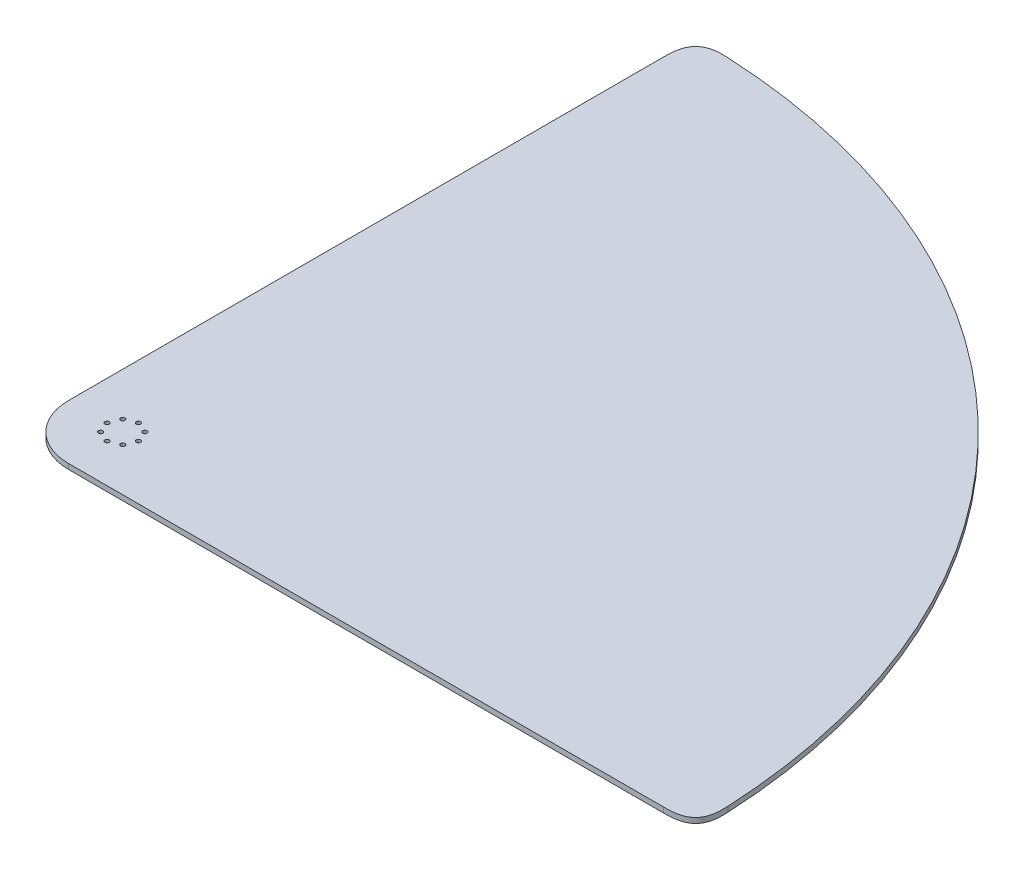
ISO-10303-21;
HEADER;
FILE_DESCRIPTION(('STEP AP214'),'2;1');
FILE_NAME('part.step','',(''),(''),'','','');
FILE_SCHEMA(('AUTOMOTIVE_DESIGN { 1 0 10303 214 1 1 1 1 }'));
ENDSEC;
DATA;
#1=APPLICATION_CONTEXT('core data for automotive mechanical design processes');
#2=APPLICATION_PROTOCOL_DEFINITION('international standard','automotive_design',2000,#1);
#3=PRODUCT_CONTEXT('',#1,'mechanical');
#4=PRODUCT('Part','Part','',(#3));
#5=PRODUCT_RELATED_PRODUCT_CATEGORY('part','',(#4));
#6=PRODUCT_DEFINITION_FORMATION('','',#4);
#7=PRODUCT_DEFINITION_CONTEXT('part definition',#1,'design');
#8=PRODUCT_DEFINITION('design','',#6,#7);
#9=PRODUCT_DEFINITION_SHAPE('','',#8);
#10=(LENGTH_UNIT() NAMED_UNIT(*) SI_UNIT(.MILLI.,.METRE.));
#11=(NAMED_UNIT(*) PLANE_ANGLE_UNIT() SI_UNIT($,.RADIAN.));
#12=(NAMED_UNIT(*) SI_UNIT($,.STERADIAN.) SOLID_ANGLE_UNIT());
#13=UNCERTAINTY_MEASURE_WITH_UNIT(LENGTH_MEASURE(1.E-05),#10,'distance_accuracy_value','');
#14=(GEOMETRIC_REPRESENTATION_CONTEXT(3) GLOBAL_UNCERTAINTY_ASSIGNED_CONTEXT((#13)) GLOBAL_UNIT_ASSIGNED_CONTEXT((#10,
#11,#12)) REPRESENTATION_CONTEXT('',''));
#15=CARTESIAN_POINT('',(0.,0.,0.));
#16=DIRECTION('',(0.,0.,1.));
#17=DIRECTION('',(1.,0.,0.));
#18=AXIS2_PLACEMENT_3D('',#15,#16,#17);
#19=CARTESIAN_POINT('',(0.,-5.,0.));
#20=DIRECTION('',(0.,1.,0.));
#21=DIRECTION('',(0.,0.,1.));
#22=AXIS2_PLACEMENT_3D('',#19,#20,#21);
#23=CYLINDRICAL_SURFACE('',#22,52.);
#24=CARTESIAN_POINT('',(0.,0.,0.));
#25=DIRECTION('',(0.,1.,0.));
#26=DIRECTION('',(0.,0.,1.));
#27=AXIS2_PLACEMENT_3D('',#24,#25,#26);
#28=CIRCLE('',#27,52.);
#29=CARTESIAN_POINT('',(-52.,0.,0.));
#30=VERTEX_POINT('',#29);
#31=CARTESIAN_POINT('',(0.,0.,52.));
#32=VERTEX_POINT('',#31);
#33=EDGE_CURVE('E285',#30,#32,#28,.T.);
#34=ORIENTED_EDGE('',*,*,#33,.F.);
#35=DIRECTION('',(0.,1.,0.));
#36=VECTOR('',#35,1.);
#37=CARTESIAN_POINT('',(-52.,-5.,0.));
#38=LINE('',#37,#36);
#39=CARTESIAN_POINT('',(-52.,-5.,0.));
#40=VERTEX_POINT('',#39);
#41=EDGE_CURVE('E121',#40,#30,#38,.T.);
#42=ORIENTED_EDGE('',*,*,#41,.F.);
#43=CARTESIAN_POINT('',(0.,-5.,0.));
#44=DIRECTION('',(0.,1.,0.));
#45=DIRECTION('',(0.,0.,1.));
#46=AXIS2_PLACEMENT_3D('',#43,#44,#45);
#47=CIRCLE('',#46,52.);
#48=CARTESIAN_POINT('',(0.,-5.,52.));
#49=VERTEX_POINT('',#48);
#50=EDGE_CURVE('E126',#40,#49,#47,.T.);
#51=ORIENTED_EDGE('',*,*,#50,.T.);
#52=DIRECTION('',(0.,1.,0.));
#53=VECTOR('',#52,1.);
#54=CARTESIAN_POINT('',(0.,-5.,52.));
#55=LINE('',#54,#53);
#56=EDGE_CURVE('E111',#49,#32,#55,.T.);
#57=ORIENTED_EDGE('',*,*,#56,.T.);
#58=EDGE_LOOP('',(#34,#42,#51,#57));
#59=FACE_BOUND('',#58,.T.);
#60=ADVANCED_FACE('F48',(#59),#23,.T.);
#61=CARTESIAN_POINT('',(-52.,-5.,0.));
#62=DIRECTION('',(-1.,0.,0.));
#63=DIRECTION('',(0.,0.,1.));
#64=AXIS2_PLACEMENT_3D('',#61,#62,#63);
#65=PLANE('',#64);
#66=DIRECTION('',(0.,0.,1.));
#67=VECTOR('',#66,1.);
#68=CARTESIAN_POINT('',(-52.,0.,0.));
#69=LINE('',#68,#67);
#70=CARTESIAN_POINT('',(-52.,0.,-569.276106091325));
#71=VERTEX_POINT('',#70);
#72=EDGE_CURVE('E131',#71,#30,#69,.T.);
#73=ORIENTED_EDGE('',*,*,#72,.F.);
#74=CARTESIAN_POINT('',(-52.,-5.25,-569.276106091325));
#75=CARTESIAN_POINT('',(-52.,-3.41666666666647,-569.276106091325));
#76=CARTESIAN_POINT('',(-52.,-1.58333333333333,-569.276106091325));
#77=CARTESIAN_POINT('',(-52.,0.25,-569.276106091325));
#78=B_SPLINE_CURVE_WITH_KNOTS('',3,(#74,#75,#76,#77),.UNSPECIFIED.,.F.,.F.,(4,4),(-0.00025,
0.00525),.UNSPECIFIED.);
#79=CARTESIAN_POINT('',(-52.,-5.,-569.276106091325));
#80=VERTEX_POINT('',#79);
#81=EDGE_CURVE('E78',#71,#80,#78,.F.);
#82=ORIENTED_EDGE('',*,*,#81,.T.);
#83=DIRECTION('',(0.,0.,1.));
#84=VECTOR('',#83,1.);
#85=CARTESIAN_POINT('',(-52.,-5.,0.));
#86=LINE('',#85,#84);
#87=EDGE_CURVE('E122',#80,#40,#86,.T.);
#88=ORIENTED_EDGE('',*,*,#87,.T.);
#89=ORIENTED_EDGE('',*,*,#41,.T.);
#90=EDGE_LOOP('',(#73,#82,#88,#89));
#91=FACE_BOUND('',#90,.T.);
#92=ADVANCED_FACE('F194',(#91),#65,.T.);
#93=CARTESIAN_POINT('',(-52.,-5.,52.));
#94=DIRECTION('',(0.,1.,0.));
#95=DIRECTION('',(0.,0.,1.));
#96=AXIS2_PLACEMENT_3D('',#93,#94,#95);
#97=CYLINDRICAL_SURFACE('',#96,652.);
#98=CARTESIAN_POINT('',(-52.,-5.,52.));
#99=DIRECTION('',(0.,1.,0.));
#100=DIRECTION('',(0.,0.,-1.));
#101=AXIS2_PLACEMENT_3D('',#98,#99,#100);
#102=CIRCLE('',#101,652.);
#103=CARTESIAN_POINT('',(599.241191594122,-5.,20.5530546623794));
#104=VERTEX_POINT('',#103);
#105=CARTESIAN_POINT('',(-20.5530546623794,-5.,-599.241191594122));
#106=VERTEX_POINT('',#105);
#107=EDGE_CURVE('E127',#104,#106,#102,.T.);
#108=ORIENTED_EDGE('',*,*,#107,.T.);
#109=CARTESIAN_POINT('',(-20.5530546623794,0.25,-599.241191594122));
#110=CARTESIAN_POINT('',(-20.5530546623794,-1.58333333333333,-599.241191594122));
#111=CARTESIAN_POINT('',(-20.5530546623794,-3.41666666666647,-599.241191594122));
#112=CARTESIAN_POINT('',(-20.5530546623794,-5.25,-599.241191594122));
#113=B_SPLINE_CURVE_WITH_KNOTS('',3,(#109,#110,#111,#112),.UNSPECIFIED.,.F.,.F.,(4,4),(-0.00025,
0.00525),.UNSPECIFIED.);
#114=CARTESIAN_POINT('',(-20.5530546623794,0.,-599.241191594122));
#115=VERTEX_POINT('',#114);
#116=EDGE_CURVE('E272',#106,#115,#113,.F.);
#117=ORIENTED_EDGE('',*,*,#116,.T.);
#118=CARTESIAN_POINT('',(-52.,0.,52.));
#119=DIRECTION('',(0.,1.,0.));
#120=DIRECTION('',(0.,0.,-1.));
#121=AXIS2_PLACEMENT_3D('',#118,#119,#120);
#122=CIRCLE('',#121,652.);
#123=CARTESIAN_POINT('',(599.241191594122,0.,20.5530546623794));
#124=VERTEX_POINT('',#123);
#125=EDGE_CURVE('E133',#124,#115,#122,.T.);
#126=ORIENTED_EDGE('',*,*,#125,.F.);
#127=CARTESIAN_POINT('',(599.241191594122,-5.25,20.5530546623794));
#128=CARTESIAN_POINT('',(599.241191594122,-3.41666666666647,20.5530546623794));
#129=CARTESIAN_POINT('',(599.241191594122,-1.58333333333333,20.5530546623794));
#130=CARTESIAN_POINT('',(599.241191594122,0.25,20.5530546623794));
#131=B_SPLINE_CURVE_WITH_KNOTS('',3,(#127,#128,#129,#130),.UNSPECIFIED.,.F.,.F.,(4,4),(-0.00025,
0.00525),.UNSPECIFIED.);
#132=EDGE_CURVE('E267',#124,#104,#131,.F.);
#133=ORIENTED_EDGE('',*,*,#132,.T.);
#134=EDGE_LOOP('',(#108,#117,#126,#133));
#135=FACE_BOUND('',#134,.T.);
#136=ADVANCED_FACE('F191',(#135),#97,.T.);
#137=CARTESIAN_POINT('',(600.,-5.,51.9999999999999));
#138=DIRECTION('',(0.,0.,1.));
#139=DIRECTION('',(1.,0.,0.));
#140=AXIS2_PLACEMENT_3D('',#137,#138,#139);
#141=PLANE('',#140);
#142=DIRECTION('',(1.,0.,0.));
#143=VECTOR('',#142,1.);
#144=CARTESIAN_POINT('',(600.,-5.,51.9999999999999));
#145=LINE('',#144,#143);
#146=CARTESIAN_POINT('',(569.276106091325,-5.,51.9999999999999));
#147=VERTEX_POINT('',#146);
#148=EDGE_CURVE('E113',#49,#147,#145,.T.);
#149=ORIENTED_EDGE('',*,*,#148,.T.);
#150=CARTESIAN_POINT('',(569.276106091325,0.25,51.9999999999999));
#151=CARTESIAN_POINT('',(569.276106091325,-1.58333333333333,51.9999999999999));
#152=CARTESIAN_POINT('',(569.276106091325,-3.41666666666647,51.9999999999999));
#153=CARTESIAN_POINT('',(569.276106091325,-5.25,51.9999999999999));
#154=B_SPLINE_CURVE_WITH_KNOTS('',3,(#150,#151,#152,#153),.UNSPECIFIED.,.F.,.F.,(4,4),(-0.00025,
0.00525),.UNSPECIFIED.);
#155=CARTESIAN_POINT('',(569.276106091325,0.,51.9999999999999));
#156=VERTEX_POINT('',#155);
#157=EDGE_CURVE('E11',#147,#156,#154,.F.);
#158=ORIENTED_EDGE('',*,*,#157,.T.);
#159=DIRECTION('',(1.,0.,0.));
#160=VECTOR('',#159,1.);
#161=CARTESIAN_POINT('',(600.,0.,51.9999999999999));
#162=LINE('',#161,#160);
#163=EDGE_CURVE('E116',#32,#156,#162,.T.);
#164=ORIENTED_EDGE('',*,*,#163,.F.);
#165=ORIENTED_EDGE('',*,*,#56,.F.);
#166=EDGE_LOOP('',(#149,#158,#164,#165));
#167=FACE_BOUND('',#166,.T.);
#168=ADVANCED_FACE('F112',(#167),#141,.T.);
#169=CARTESIAN_POINT('',(0.,-5.,0.));
#170=DIRECTION('',(0.,1.,0.));
#171=DIRECTION('',(0.,0.,1.));
#172=AXIS2_PLACEMENT_3D('',#169,#170,#171);
#173=PLANE('',#172);
#174=CARTESIAN_POINT('',(0.,-5.,-15.));
#175=DIRECTION('',(0.,1.,0.));
#176=DIRECTION('',(0.,0.,1.));
#177=AXIS2_PLACEMENT_3D('',#174,#175,#176);
#178=CIRCLE('',#177,2.1);
#179=CARTESIAN_POINT('',(0.,-5.,-12.9));
#180=VERTEX_POINT('',#179);
#181=EDGE_CURVE('E377',#180,#180,#178,.T.);
#182=ORIENTED_EDGE('',*,*,#181,.T.);
#183=EDGE_LOOP('',(#182));
#184=FACE_BOUND('',#183,.T.);
#185=CARTESIAN_POINT('',(10.6066017177982,-5.,-10.6066017177982));
#186=DIRECTION('',(0.,1.,0.));
#187=DIRECTION('',(0.,0.,1.));
#188=AXIS2_PLACEMENT_3D('',#185,#186,#187);
#189=CIRCLE('',#188,2.1);
#190=CARTESIAN_POINT('',(10.6066017177982,-5.,-8.50660171779821));
#191=VERTEX_POINT('',#190);
#192=EDGE_CURVE('E373',#191,#191,#189,.T.);
#193=ORIENTED_EDGE('',*,*,#192,.T.);
#194=EDGE_LOOP('',(#193));
#195=FACE_BOUND('',#194,.T.);
#196=CARTESIAN_POINT('',(15.,-5.,0.));
#197=DIRECTION('',(0.,1.,0.));
#198=DIRECTION('',(0.,0.,1.));
#199=AXIS2_PLACEMENT_3D('',#196,#197,#198);
#200=CIRCLE('',#199,2.1);
#201=CARTESIAN_POINT('',(15.,-5.,2.1));
#202=VERTEX_POINT('',#201);
#203=EDGE_CURVE('E369',#202,#202,#200,.T.);
#204=ORIENTED_EDGE('',*,*,#203,.T.);
#205=EDGE_LOOP('',(#204));
#206=FACE_BOUND('',#205,.T.);
#207=CARTESIAN_POINT('',(10.6066017177982,-5.,10.6066017177982));
#208=DIRECTION('',(0.,1.,0.));
#209=DIRECTION('',(0.,0.,1.));
#210=AXIS2_PLACEMENT_3D('',#207,#208,#209);
#211=CIRCLE('',#210,2.1);
#212=CARTESIAN_POINT('',(10.6066017177982,-5.,12.7066017177982));
#213=VERTEX_POINT('',#212);
#214=EDGE_CURVE('E365',#213,#213,#211,.T.);
#215=ORIENTED_EDGE('',*,*,#214,.T.);
#216=EDGE_LOOP('',(#215));
#217=FACE_BOUND('',#216,.T.);
#218=CARTESIAN_POINT('',(0.,-5.,15.));
#219=DIRECTION('',(0.,1.,0.));
#220=DIRECTION('',(0.,0.,1.));
#221=AXIS2_PLACEMENT_3D('',#218,#219,#220);
#222=CIRCLE('',#221,2.1);
#223=CARTESIAN_POINT('',(0.,-5.,17.1));
#224=VERTEX_POINT('',#223);
#225=EDGE_CURVE('E361',#224,#224,#222,.T.);
#226=ORIENTED_EDGE('',*,*,#225,.T.);
#227=EDGE_LOOP('',(#226));
#228=FACE_BOUND('',#227,.T.);
#229=CARTESIAN_POINT('',(-10.6066017177982,-5.,10.6066017177982));
#230=DIRECTION('',(0.,1.,0.));
#231=DIRECTION('',(0.,0.,1.));
#232=AXIS2_PLACEMENT_3D('',#229,#230,#231);
#233=CIRCLE('',#232,2.1);
#234=CARTESIAN_POINT('',(-10.6066017177982,-5.,12.7066017177982));
#235=VERTEX_POINT('',#234);
#236=EDGE_CURVE('E357',#235,#235,#233,.T.);
#237=ORIENTED_EDGE('',*,*,#236,.T.);
#238=EDGE_LOOP('',(#237));
#239=FACE_BOUND('',#238,.T.);
#240=CARTESIAN_POINT('',(-15.,-5.,0.));
#241=DIRECTION('',(0.,1.,0.));
#242=DIRECTION('',(0.,0.,1.));
#243=AXIS2_PLACEMENT_3D('',#240,#241,#242);
#244=CIRCLE('',#243,2.1);
#245=CARTESIAN_POINT('',(-15.,-5.,2.1));
#246=VERTEX_POINT('',#245);
#247=EDGE_CURVE('E351',#246,#246,#244,.T.);
#248=ORIENTED_EDGE('',*,*,#247,.T.);
#249=EDGE_LOOP('',(#248));
#250=FACE_BOUND('',#249,.T.);
#251=CARTESIAN_POINT('',(-10.6066017177982,-5.,-10.6066017177982));
#252=DIRECTION('',(0.,1.,0.));
#253=DIRECTION('',(0.,0.,1.));
#254=AXIS2_PLACEMENT_3D('',#251,#252,#253);
#255=CIRCLE('',#254,2.1);
#256=CARTESIAN_POINT('',(-10.6066017177982,-5.,-8.50660171779822));
#257=VERTEX_POINT('',#256);
#258=EDGE_CURVE('E137',#257,#257,#255,.T.);
#259=ORIENTED_EDGE('',*,*,#258,.T.);
#260=EDGE_LOOP('',(#259));
#261=FACE_BOUND('',#260,.T.);
#262=ORIENTED_EDGE('',*,*,#87,.F.);
#263=CARTESIAN_POINT('',(-20.5530546623794,-5.,-599.241191594122));
#264=CARTESIAN_POINT('',(-25.9071720040652,-5.,-599.499729655824));
#265=CARTESIAN_POINT('',(-31.2092317808589,-5.,-599.700602723466));
#266=CARTESIAN_POINT('',(-42.659594251295,-5.,-597.949848077784));
#267=CARTESIAN_POINT('',(-49.6612800793085,-5.,-591.385368921393));
#268=CARTESIAN_POINT('',(-52.,-5.,-579.782278767682));
#269=CARTESIAN_POINT('',(-52.,-5.,-574.529192429504));
#270=CARTESIAN_POINT('',(-52.,-5.,-569.276106091325));
#271=B_SPLINE_CURVE_WITH_KNOTS('',5,(#263,#264,#265,#266,#267,#268,#269,#270),.UNSPECIFIED.,.F.,
.F.,(6,2,6),(0.,0.5,1.),.UNSPECIFIED.);
#272=EDGE_CURVE('E62',#80,#106,#271,.F.);
#273=ORIENTED_EDGE('',*,*,#272,.T.);
#274=ORIENTED_EDGE('',*,*,#107,.F.);
#275=CARTESIAN_POINT('',(569.276106091326,-5.,52.));
#276=CARTESIAN_POINT('',(574.529192429504,-5.,52.));
#277=CARTESIAN_POINT('',(579.782278767682,-5.,52.));
#278=CARTESIAN_POINT('',(591.385368921393,-5.,49.6612800793084));
#279=CARTESIAN_POINT('',(597.949848077784,-5.,42.659594251295));
#280=CARTESIAN_POINT('',(599.700602723467,-5.,31.2092317808588));
#281=CARTESIAN_POINT('',(599.499729655824,-5.,25.9071720040651));
#282=CARTESIAN_POINT('',(599.241191594122,-5.,20.5530546623794));
#283=B_SPLINE_CURVE_WITH_KNOTS('',5,(#275,#276,#277,#278,#279,#280,#281,#282),.UNSPECIFIED.,.F.,
.F.,(6,2,6),(0.,0.5,1.),.UNSPECIFIED.);
#284=EDGE_CURVE('E69',#104,#147,#283,.F.);
#285=ORIENTED_EDGE('',*,*,#284,.T.);
#286=ORIENTED_EDGE('',*,*,#148,.F.);
#287=ORIENTED_EDGE('',*,*,#50,.F.);
#288=EDGE_LOOP('',(#262,#273,#274,#285,#286,#287));
#289=FACE_BOUND('',#288,.T.);
#290=ADVANCED_FACE('F125',(#184,#195,#206,#217,#228,#239,#250,#261,#289),#173,.F.);
#291=CARTESIAN_POINT('',(0.,0.,0.));
#292=DIRECTION('',(0.,1.,0.));
#293=DIRECTION('',(0.,0.,1.));
#294=AXIS2_PLACEMENT_3D('',#291,#292,#293);
#295=PLANE('',#294);
#296=CARTESIAN_POINT('',(0.,0.,-15.));
#297=DIRECTION('',(0.,1.,0.));
#298=DIRECTION('',(0.,0.,1.));
#299=AXIS2_PLACEMENT_3D('',#296,#297,#298);
#300=CIRCLE('',#299,2.1);
#301=CARTESIAN_POINT('',(0.,0.,-12.9));
#302=VERTEX_POINT('',#301);
#303=EDGE_CURVE('E322',#302,#302,#300,.T.);
#304=ORIENTED_EDGE('',*,*,#303,.F.);
#305=EDGE_LOOP('',(#304));
#306=FACE_BOUND('',#305,.T.);
#307=CARTESIAN_POINT('',(10.6066017177982,0.,-10.6066017177982));
#308=DIRECTION('',(0.,1.,0.));
#309=DIRECTION('',(0.,0.,1.));
#310=AXIS2_PLACEMENT_3D('',#307,#308,#309);
#311=CIRCLE('',#310,2.1);
#312=CARTESIAN_POINT('',(10.6066017177982,0.,-8.50660171779821));
#313=VERTEX_POINT('',#312);
#314=EDGE_CURVE('E326',#313,#313,#311,.T.);
#315=ORIENTED_EDGE('',*,*,#314,.F.);
#316=EDGE_LOOP('',(#315));
#317=FACE_BOUND('',#316,.T.);
#318=CARTESIAN_POINT('',(15.,0.,0.));
#319=DIRECTION('',(0.,1.,0.));
#320=DIRECTION('',(0.,0.,1.));
#321=AXIS2_PLACEMENT_3D('',#318,#319,#320);
#322=CIRCLE('',#321,2.1);
#323=CARTESIAN_POINT('',(15.,0.,2.1));
#324=VERTEX_POINT('',#323);
#325=EDGE_CURVE('E330',#324,#324,#322,.T.);
#326=ORIENTED_EDGE('',*,*,#325,.F.);
#327=EDGE_LOOP('',(#326));
#328=FACE_BOUND('',#327,.T.);
#329=CARTESIAN_POINT('',(10.6066017177982,0.,10.6066017177982));
#330=DIRECTION('',(0.,1.,0.));
#331=DIRECTION('',(0.,0.,1.));
#332=AXIS2_PLACEMENT_3D('',#329,#330,#331);
#333=CIRCLE('',#332,2.1);
#334=CARTESIAN_POINT('',(10.6066017177982,0.,12.7066017177982));
#335=VERTEX_POINT('',#334);
#336=EDGE_CURVE('E334',#335,#335,#333,.T.);
#337=ORIENTED_EDGE('',*,*,#336,.F.);
#338=EDGE_LOOP('',(#337));
#339=FACE_BOUND('',#338,.T.);
#340=CARTESIAN_POINT('',(0.,0.,15.));
#341=DIRECTION('',(0.,1.,0.));
#342=DIRECTION('',(0.,0.,1.));
#343=AXIS2_PLACEMENT_3D('',#340,#341,#342);
#344=CIRCLE('',#343,2.1);
#345=CARTESIAN_POINT('',(0.,0.,17.1));
#346=VERTEX_POINT('',#345);
#347=EDGE_CURVE('E338',#346,#346,#344,.T.);
#348=ORIENTED_EDGE('',*,*,#347,.F.);
#349=EDGE_LOOP('',(#348));
#350=FACE_BOUND('',#349,.T.);
#351=CARTESIAN_POINT('',(-10.6066017177982,0.,10.6066017177982));
#352=DIRECTION('',(0.,1.,0.));
#353=DIRECTION('',(0.,0.,1.));
#354=AXIS2_PLACEMENT_3D('',#351,#352,#353);
#355=CIRCLE('',#354,2.1);
#356=CARTESIAN_POINT('',(-10.6066017177982,0.,12.7066017177982));
#357=VERTEX_POINT('',#356);
#358=EDGE_CURVE('E342',#357,#357,#355,.T.);
#359=ORIENTED_EDGE('',*,*,#358,.F.);
#360=EDGE_LOOP('',(#359));
#361=FACE_BOUND('',#360,.T.);
#362=CARTESIAN_POINT('',(-15.,0.,0.));
#363=DIRECTION('',(0.,1.,0.));
#364=DIRECTION('',(0.,0.,1.));
#365=AXIS2_PLACEMENT_3D('',#362,#363,#364);
#366=CIRCLE('',#365,2.1);
#367=CARTESIAN_POINT('',(-15.,0.,2.1));
#368=VERTEX_POINT('',#367);
#369=EDGE_CURVE('E346',#368,#368,#366,.T.);
#370=ORIENTED_EDGE('',*,*,#369,.F.);
#371=EDGE_LOOP('',(#370));
#372=FACE_BOUND('',#371,.T.);
#373=CARTESIAN_POINT('',(-10.6066017177982,0.,-10.6066017177982));
#374=DIRECTION('',(0.,1.,0.));
#375=DIRECTION('',(0.,0.,1.));
#376=AXIS2_PLACEMENT_3D('',#373,#374,#375);
#377=CIRCLE('',#376,2.1);
#378=CARTESIAN_POINT('',(-10.6066017177982,0.,-8.50660171779821));
#379=VERTEX_POINT('',#378);
#380=EDGE_CURVE('E349',#379,#379,#377,.T.);
#381=ORIENTED_EDGE('',*,*,#380,.F.);
#382=EDGE_LOOP('',(#381));
#383=FACE_BOUND('',#382,.T.);
#384=ORIENTED_EDGE('',*,*,#125,.T.);
#385=CARTESIAN_POINT('',(-52.,0.,-569.276106091325));
#386=CARTESIAN_POINT('',(-52.,0.,-574.529192429504));
#387=CARTESIAN_POINT('',(-52.,0.,-579.782278767682));
#388=CARTESIAN_POINT('',(-49.6612800793085,0.,-591.385368921393));
#389=CARTESIAN_POINT('',(-42.659594251295,0.,-597.949848077784));
#390=CARTESIAN_POINT('',(-31.2092317808589,0.,-599.700602723466));
#391=CARTESIAN_POINT('',(-25.9071720040652,0.,-599.499729655824));
#392=CARTESIAN_POINT('',(-20.5530546623794,0.,-599.241191594122));
#393=B_SPLINE_CURVE_WITH_KNOTS('',5,(#385,#386,#387,#388,#389,#390,#391,#392),.UNSPECIFIED.,.F.,
.F.,(6,2,6),(0.,0.5,1.),.UNSPECIFIED.);
#394=EDGE_CURVE('E303',#115,#71,#393,.F.);
#395=ORIENTED_EDGE('',*,*,#394,.T.);
#396=ORIENTED_EDGE('',*,*,#72,.T.);
#397=ORIENTED_EDGE('',*,*,#33,.T.);
#398=ORIENTED_EDGE('',*,*,#163,.T.);
#399=CARTESIAN_POINT('',(599.241191594122,0.,20.5530546623794));
#400=CARTESIAN_POINT('',(599.499729655824,0.,25.9071720040651));
#401=CARTESIAN_POINT('',(599.700602723466,0.,31.2092317808588));
#402=CARTESIAN_POINT('',(597.949848077784,0.,42.659594251295));
#403=CARTESIAN_POINT('',(591.385368921393,0.,49.6612800793084));
#404=CARTESIAN_POINT('',(579.782278767682,0.,51.9999999999999));
#405=CARTESIAN_POINT('',(574.529192429504,0.,51.9999999999999));
#406=CARTESIAN_POINT('',(569.276106091325,0.,51.9999999999999));
#407=B_SPLINE_CURVE_WITH_KNOTS('',5,(#399,#400,#401,#402,#403,#404,#405,#406),.UNSPECIFIED.,.F.,
.F.,(6,2,6),(0.,0.5,1.),.UNSPECIFIED.);
#408=EDGE_CURVE('E241',#156,#124,#407,.F.);
#409=ORIENTED_EDGE('',*,*,#408,.T.);
#410=EDGE_LOOP('',(#384,#395,#396,#397,#398,#409));
#411=FACE_BOUND('',#410,.T.);
#412=ADVANCED_FACE('F162',(#306,#317,#328,#339,#350,#361,#372,#383,#411),#295,.T.);
#413=CARTESIAN_POINT('',(-20.5530546623794,-5.25,-599.241191594122));
#414=CARTESIAN_POINT('',(-20.5530546623794,-3.41666666666647,-599.241191594122));
#415=CARTESIAN_POINT('',(-20.5530546623794,-1.58333333333333,-599.241191594122));
#416=CARTESIAN_POINT('',(-20.5530546623794,0.25,-599.241191594122));
#417=CARTESIAN_POINT('',(-25.9071720040652,-5.25,-599.499729655824));
#418=CARTESIAN_POINT('',(-25.9071720040652,-3.41666666666647,-599.499729655824));
#419=CARTESIAN_POINT('',(-25.9071720040652,-1.58333333333333,-599.499729655824));
#420=CARTESIAN_POINT('',(-25.9071720040652,0.25,-599.499729655824));
#421=CARTESIAN_POINT('',(-31.2092317808589,-5.25,-599.700602723466));
#422=CARTESIAN_POINT('',(-31.2092317808589,-3.41666666666647,-599.700602723466));
#423=CARTESIAN_POINT('',(-31.2092317808589,-1.58333333333333,-599.700602723466));
#424=CARTESIAN_POINT('',(-31.2092317808589,0.25,-599.700602723466));
#425=CARTESIAN_POINT('',(-42.659594251295,-5.25,-597.949848077784));
#426=CARTESIAN_POINT('',(-42.659594251295,-3.41666666666647,-597.949848077784));
#427=CARTESIAN_POINT('',(-42.659594251295,-1.58333333333333,-597.949848077784));
#428=CARTESIAN_POINT('',(-42.659594251295,0.25,-597.949848077784));
#429=CARTESIAN_POINT('',(-49.6612800793085,-5.25,-591.385368921393));
#430=CARTESIAN_POINT('',(-49.6612800793085,-3.41666666666647,-591.385368921393));
#431=CARTESIAN_POINT('',(-49.6612800793085,-1.58333333333333,-591.385368921393));
#432=CARTESIAN_POINT('',(-49.6612800793085,0.25,-591.385368921393));
#433=CARTESIAN_POINT('',(-52.,-5.25,-579.782278767682));
#434=CARTESIAN_POINT('',(-52.,-3.41666666666647,-579.782278767682));
#435=CARTESIAN_POINT('',(-52.,-1.58333333333333,-579.782278767682));
#436=CARTESIAN_POINT('',(-52.,0.25,-579.782278767682));
#437=CARTESIAN_POINT('',(-52.,-5.25,-574.529192429504));
#438=CARTESIAN_POINT('',(-52.,-3.41666666666647,-574.529192429504));
#439=CARTESIAN_POINT('',(-52.,-1.58333333333333,-574.529192429504));
#440=CARTESIAN_POINT('',(-52.,0.25,-574.529192429504));
#441=CARTESIAN_POINT('',(-52.,-5.25,-569.276106091325));
#442=CARTESIAN_POINT('',(-52.,-3.41666666666647,-569.276106091325));
#443=CARTESIAN_POINT('',(-52.,-1.58333333333333,-569.276106091325));
#444=CARTESIAN_POINT('',(-52.,0.25,-569.276106091325));
#445=B_SPLINE_SURFACE_WITH_KNOTS('',5,3,((#413,#414,#415,#416),(#417,#418,#419,#420),(#421,#422,
#423,#424),(#425,#426,#427,#428),(#429,#430,#431,#432),(#433,#434,#435,#436),(#437,#438,#439,
#440),(#441,#442,#443,#444)),.UNSPECIFIED.,.F.,.F.,.F.,(6,2,6),(4,4),(0.,0.5,1.),(-0.00025,
0.00525),.UNSPECIFIED.);
#446=ORIENTED_EDGE('',*,*,#272,.F.);
#447=ORIENTED_EDGE('',*,*,#81,.F.);
#448=ORIENTED_EDGE('',*,*,#394,.F.);
#449=ORIENTED_EDGE('',*,*,#116,.F.);
#450=EDGE_LOOP('',(#446,#447,#448,#449));
#451=FACE_BOUND('',#450,.T.);
#452=ADVANCED_FACE('F196',(#451),#445,.T.);
#453=CARTESIAN_POINT('',(569.276106091325,-5.25,51.9999999999999));
#454=CARTESIAN_POINT('',(569.276106091325,-3.41666666666647,51.9999999999999));
#455=CARTESIAN_POINT('',(569.276106091325,-1.58333333333333,51.9999999999999));
#456=CARTESIAN_POINT('',(569.276106091325,0.25,51.9999999999999));
#457=CARTESIAN_POINT('',(574.529192429504,-5.25,51.9999999999999));
#458=CARTESIAN_POINT('',(574.529192429504,-3.41666666666647,51.9999999999999));
#459=CARTESIAN_POINT('',(574.529192429504,-1.58333333333333,51.9999999999999));
#460=CARTESIAN_POINT('',(574.529192429504,0.25,51.9999999999999));
#461=CARTESIAN_POINT('',(579.782278767682,-5.25,51.9999999999999));
#462=CARTESIAN_POINT('',(579.782278767682,-3.41666666666647,51.9999999999999));
#463=CARTESIAN_POINT('',(579.782278767682,-1.58333333333333,51.9999999999999));
#464=CARTESIAN_POINT('',(579.782278767682,0.25,51.9999999999999));
#465=CARTESIAN_POINT('',(591.385368921393,-5.25,49.6612800793084));
#466=CARTESIAN_POINT('',(591.385368921393,-3.41666666666647,49.6612800793084));
#467=CARTESIAN_POINT('',(591.385368921393,-1.58333333333333,49.6612800793084));
#468=CARTESIAN_POINT('',(591.385368921393,0.25,49.6612800793084));
#469=CARTESIAN_POINT('',(597.949848077784,-5.25,42.659594251295));
#470=CARTESIAN_POINT('',(597.949848077784,-3.41666666666647,42.659594251295));
#471=CARTESIAN_POINT('',(597.949848077784,-1.58333333333333,42.659594251295));
#472=CARTESIAN_POINT('',(597.949848077784,0.25,42.659594251295));
#473=CARTESIAN_POINT('',(599.700602723466,-5.25,31.2092317808588));
#474=CARTESIAN_POINT('',(599.700602723466,-3.41666666666647,31.2092317808588));
#475=CARTESIAN_POINT('',(599.700602723466,-1.58333333333333,31.2092317808588));
#476=CARTESIAN_POINT('',(599.700602723466,0.25,31.2092317808588));
#477=CARTESIAN_POINT('',(599.499729655824,-5.25,25.9071720040651));
#478=CARTESIAN_POINT('',(599.499729655824,-3.41666666666647,25.9071720040651));
#479=CARTESIAN_POINT('',(599.499729655824,-1.58333333333333,25.9071720040651));
#480=CARTESIAN_POINT('',(599.499729655824,0.25,25.9071720040651));
#481=CARTESIAN_POINT('',(599.241191594122,-5.25,20.5530546623794));
#482=CARTESIAN_POINT('',(599.241191594122,-3.41666666666647,20.5530546623794));
#483=CARTESIAN_POINT('',(599.241191594122,-1.58333333333333,20.5530546623794));
#484=CARTESIAN_POINT('',(599.241191594122,0.25,20.5530546623794));
#485=B_SPLINE_SURFACE_WITH_KNOTS('',5,3,((#453,#454,#455,#456),(#457,#458,#459,#460),(#461,#462,
#463,#464),(#465,#466,#467,#468),(#469,#470,#471,#472),(#473,#474,#475,#476),(#477,#478,#479,
#480),(#481,#482,#483,#484)),.UNSPECIFIED.,.F.,.F.,.F.,(6,2,6),(4,4),(0.,0.5,1.),(-0.00025,
0.00525),.UNSPECIFIED.);
#486=ORIENTED_EDGE('',*,*,#284,.F.);
#487=ORIENTED_EDGE('',*,*,#132,.F.);
#488=ORIENTED_EDGE('',*,*,#408,.F.);
#489=ORIENTED_EDGE('',*,*,#157,.F.);
#490=EDGE_LOOP('',(#486,#487,#488,#489));
#491=FACE_BOUND('',#490,.T.);
#492=ADVANCED_FACE('F51',(#491),#485,.T.);
#493=CARTESIAN_POINT('',(-10.6066017177982,0.,-10.6066017177982));
#494=DIRECTION('',(0.,1.,0.));
#495=DIRECTION('',(0.,0.,1.));
#496=AXIS2_PLACEMENT_3D('',#493,#494,#495);
#497=CYLINDRICAL_SURFACE('',#496,2.1);
#498=ORIENTED_EDGE('',*,*,#380,.T.);
#499=EDGE_LOOP('',(#498));
#500=FACE_BOUND('',#499,.T.);
#501=ORIENTED_EDGE('',*,*,#258,.F.);
#502=EDGE_LOOP('',(#501));
#503=FACE_BOUND('',#502,.T.);
#504=ADVANCED_FACE('F164',(#500,#503),#497,.F.);
#505=CARTESIAN_POINT('',(-15.,0.,0.));
#506=DIRECTION('',(0.,1.,0.));
#507=DIRECTION('',(0.,0.,1.));
#508=AXIS2_PLACEMENT_3D('',#505,#506,#507);
#509=CYLINDRICAL_SURFACE('',#508,2.1);
#510=ORIENTED_EDGE('',*,*,#369,.T.);
#511=EDGE_LOOP('',(#510));
#512=FACE_BOUND('',#511,.T.);
#513=ORIENTED_EDGE('',*,*,#247,.F.);
#514=EDGE_LOOP('',(#513));
#515=FACE_BOUND('',#514,.T.);
#516=ADVANCED_FACE('F403',(#512,#515),#509,.F.);
#517=CARTESIAN_POINT('',(-10.6066017177982,0.,10.6066017177982));
#518=DIRECTION('',(0.,1.,0.));
#519=DIRECTION('',(0.,0.,1.));
#520=AXIS2_PLACEMENT_3D('',#517,#518,#519);
#521=CYLINDRICAL_SURFACE('',#520,2.1);
#522=ORIENTED_EDGE('',*,*,#358,.T.);
#523=EDGE_LOOP('',(#522));
#524=FACE_BOUND('',#523,.T.);
#525=ORIENTED_EDGE('',*,*,#236,.F.);
#526=EDGE_LOOP('',(#525));
#527=FACE_BOUND('',#526,.T.);
#528=ADVANCED_FACE('F408',(#524,#527),#521,.F.);
#529=CARTESIAN_POINT('',(0.,0.,15.));
#530=DIRECTION('',(0.,1.,0.));
#531=DIRECTION('',(0.,0.,1.));
#532=AXIS2_PLACEMENT_3D('',#529,#530,#531);
#533=CYLINDRICAL_SURFACE('',#532,2.1);
#534=ORIENTED_EDGE('',*,*,#347,.T.);
#535=EDGE_LOOP('',(#534));
#536=FACE_BOUND('',#535,.T.);
#537=ORIENTED_EDGE('',*,*,#225,.F.);
#538=EDGE_LOOP('',(#537));
#539=FACE_BOUND('',#538,.T.);
#540=ADVANCED_FACE('F502',(#536,#539),#533,.F.);
#541=CARTESIAN_POINT('',(10.6066017177982,0.,10.6066017177982));
#542=DIRECTION('',(0.,1.,0.));
#543=DIRECTION('',(0.,0.,1.));
#544=AXIS2_PLACEMENT_3D('',#541,#542,#543);
#545=CYLINDRICAL_SURFACE('',#544,2.1);
#546=ORIENTED_EDGE('',*,*,#336,.T.);
#547=EDGE_LOOP('',(#546));
#548=FACE_BOUND('',#547,.T.);
#549=ORIENTED_EDGE('',*,*,#214,.F.);
#550=EDGE_LOOP('',(#549));
#551=FACE_BOUND('',#550,.T.);
#552=ADVANCED_FACE('F512',(#548,#551),#545,.F.);
#553=CARTESIAN_POINT('',(15.,0.,0.));
#554=DIRECTION('',(0.,1.,0.));
#555=DIRECTION('',(0.,0.,1.));
#556=AXIS2_PLACEMENT_3D('',#553,#554,#555);
#557=CYLINDRICAL_SURFACE('',#556,2.1);
#558=ORIENTED_EDGE('',*,*,#325,.T.);
#559=EDGE_LOOP('',(#558));
#560=FACE_BOUND('',#559,.T.);
#561=ORIENTED_EDGE('',*,*,#203,.F.);
#562=EDGE_LOOP('',(#561));
#563=FACE_BOUND('',#562,.T.);
#564=ADVANCED_FACE('F522',(#560,#563),#557,.F.);
#565=CARTESIAN_POINT('',(10.6066017177982,0.,-10.6066017177982));
#566=DIRECTION('',(0.,1.,0.));
#567=DIRECTION('',(0.,0.,1.));
#568=AXIS2_PLACEMENT_3D('',#565,#566,#567);
#569=CYLINDRICAL_SURFACE('',#568,2.1);
#570=ORIENTED_EDGE('',*,*,#314,.T.);
#571=EDGE_LOOP('',(#570));
#572=FACE_BOUND('',#571,.T.);
#573=ORIENTED_EDGE('',*,*,#192,.F.);
#574=EDGE_LOOP('',(#573));
#575=FACE_BOUND('',#574,.T.);
#576=ADVANCED_FACE('F384',(#572,#575),#569,.F.);
#577=CARTESIAN_POINT('',(0.,0.,-15.));
#578=DIRECTION('',(0.,1.,0.));
#579=DIRECTION('',(0.,0.,1.));
#580=AXIS2_PLACEMENT_3D('',#577,#578,#579);
#581=CYLINDRICAL_SURFACE('',#580,2.1);
#582=ORIENTED_EDGE('',*,*,#303,.T.);
#583=EDGE_LOOP('',(#582));
#584=FACE_BOUND('',#583,.T.);
#585=ORIENTED_EDGE('',*,*,#181,.F.);
#586=EDGE_LOOP('',(#585));
#587=FACE_BOUND('',#586,.T.);
#588=ADVANCED_FACE('F381',(#584,#587),#581,.F.);
#589=CLOSED_SHELL('',(#60,#92,#136,#168,#290,#412,#452,#492,#504,#516,#528,#540,#552,#564,#576,#588));
#590=MANIFOLD_SOLID_BREP('B2',#589);
#591=ADVANCED_BREP_SHAPE_REPRESENTATION('',(#18,#590),#14);
#592=SHAPE_DEFINITION_REPRESENTATION(#9,#591);
ENDSEC;
END-ISO-10303-21;
